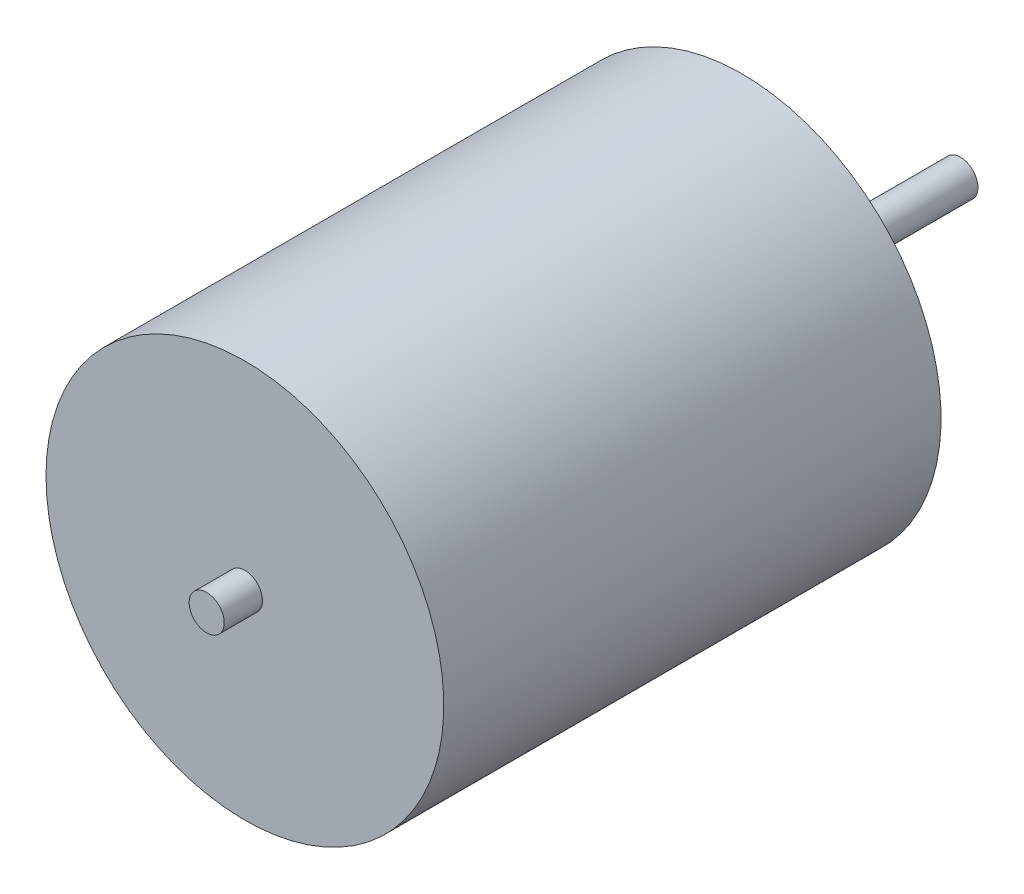
ISO-10303-21;
HEADER;
FILE_DESCRIPTION(('STEP AP214'),'2;1');
FILE_NAME('part.step','',(''),(''),'','','');
FILE_SCHEMA(('AUTOMOTIVE_DESIGN { 1 0 10303 214 1 1 1 1 }'));
ENDSEC;
DATA;
#1=APPLICATION_CONTEXT('core data for automotive mechanical design processes');
#2=APPLICATION_PROTOCOL_DEFINITION('international standard','automotive_design',2000,#1);
#3=PRODUCT_CONTEXT('',#1,'mechanical');
#4=PRODUCT('Part','Part','',(#3));
#5=PRODUCT_RELATED_PRODUCT_CATEGORY('part','',(#4));
#6=PRODUCT_DEFINITION_FORMATION('','',#4);
#7=PRODUCT_DEFINITION_CONTEXT('part definition',#1,'design');
#8=PRODUCT_DEFINITION('design','',#6,#7);
#9=PRODUCT_DEFINITION_SHAPE('','',#8);
#10=(LENGTH_UNIT() NAMED_UNIT(*) SI_UNIT(.MILLI.,.METRE.));
#11=(NAMED_UNIT(*) PLANE_ANGLE_UNIT() SI_UNIT($,.RADIAN.));
#12=(NAMED_UNIT(*) SI_UNIT($,.STERADIAN.) SOLID_ANGLE_UNIT());
#13=UNCERTAINTY_MEASURE_WITH_UNIT(LENGTH_MEASURE(1.E-05),#10,'distance_accuracy_value','');
#14=(GEOMETRIC_REPRESENTATION_CONTEXT(3) GLOBAL_UNCERTAINTY_ASSIGNED_CONTEXT((#13)) GLOBAL_UNIT_ASSIGNED_CONTEXT((#10,
#11,#12)) REPRESENTATION_CONTEXT('',''));
#15=CARTESIAN_POINT('',(0.,0.,0.));
#16=DIRECTION('',(0.,0.,1.));
#17=DIRECTION('',(1.,0.,0.));
#18=AXIS2_PLACEMENT_3D('',#15,#16,#17);
#19=CARTESIAN_POINT('',(0.,0.,0.));
#20=DIRECTION('',(0.,0.,-1.));
#21=DIRECTION('',(-1.,0.,0.));
#22=AXIS2_PLACEMENT_3D('',#19,#20,#21);
#23=PLANE('',#22);
#24=CARTESIAN_POINT('',(0.,0.,0.));
#25=DIRECTION('',(0.,0.,-1.));
#26=DIRECTION('',(-1.,0.,0.));
#27=AXIS2_PLACEMENT_3D('',#24,#25,#26);
#28=CIRCLE('',#27,1.5875);
#29=CARTESIAN_POINT('',(-1.5875,0.,0.));
#30=VERTEX_POINT('',#29);
#31=EDGE_CURVE('E171',#30,#30,#28,.T.);
#32=ORIENTED_EDGE('',*,*,#31,.T.);
#33=EDGE_LOOP('',(#32));
#34=FACE_BOUND('',#33,.T.);
#35=CARTESIAN_POINT('',(0.,0.,0.));
#36=DIRECTION('',(0.,0.,-1.));
#37=DIRECTION('',(-1.,0.,0.));
#38=AXIS2_PLACEMENT_3D('',#35,#36,#37);
#39=CIRCLE('',#38,18.);
#40=CARTESIAN_POINT('',(-18.,0.,0.));
#41=VERTEX_POINT('',#40);
#42=EDGE_CURVE('E11',#41,#41,#39,.T.);
#43=ORIENTED_EDGE('',*,*,#42,.F.);
#44=EDGE_LOOP('',(#43));
#45=FACE_BOUND('',#44,.T.);
#46=ADVANCED_FACE('F35',(#34,#45),#23,.F.);
#47=CARTESIAN_POINT('',(0.,0.,-54.9738707388882));
#48=DIRECTION('',(0.,0.,-1.));
#49=DIRECTION('',(-1.,0.,0.));
#50=AXIS2_PLACEMENT_3D('',#47,#48,#49);
#51=CYLINDRICAL_SURFACE('',#50,18.);
#52=CARTESIAN_POINT('',(0.,0.,-45.));
#53=DIRECTION('',(0.,0.,-1.));
#54=DIRECTION('',(-1.,0.,0.));
#55=AXIS2_PLACEMENT_3D('',#52,#53,#54);
#56=CIRCLE('',#55,18.);
#57=CARTESIAN_POINT('',(-18.,0.,-45.));
#58=VERTEX_POINT('',#57);
#59=EDGE_CURVE('E43',#58,#58,#56,.T.);
#60=ORIENTED_EDGE('',*,*,#59,.F.);
#61=EDGE_LOOP('',(#60));
#62=FACE_BOUND('',#61,.T.);
#63=ORIENTED_EDGE('',*,*,#42,.T.);
#64=EDGE_LOOP('',(#63));
#65=FACE_BOUND('',#64,.T.);
#66=ADVANCED_FACE('F191',(#62,#65),#51,.T.);
#67=CARTESIAN_POINT('',(18.,0.,-45.));
#68=DIRECTION('',(0.,0.,1.));
#69=DIRECTION('',(1.,0.,0.));
#70=AXIS2_PLACEMENT_3D('',#67,#68,#69);
#71=PLANE('',#70);
#72=CARTESIAN_POINT('',(9.54594154601818,-9.54594154601861,-45.));
#73=DIRECTION('',(0.,0.,-1.));
#74=DIRECTION('',(1.,0.,0.));
#75=AXIS2_PLACEMENT_3D('',#72,#73,#74);
#76=CIRCLE('',#75,1.5);
#77=CARTESIAN_POINT('',(11.0459415460182,-9.54594154601861,-45.));
#78=VERTEX_POINT('',#77);
#79=EDGE_CURVE('E243',#78,#78,#76,.T.);
#80=ORIENTED_EDGE('',*,*,#79,.F.);
#81=EDGE_LOOP('',(#80));
#82=FACE_BOUND('',#81,.T.);
#83=CARTESIAN_POINT('',(-9.54594154601837,9.54594154601841,-45.));
#84=DIRECTION('',(0.,0.,-1.));
#85=DIRECTION('',(-1.,0.,0.));
#86=AXIS2_PLACEMENT_3D('',#83,#84,#85);
#87=CIRCLE('',#86,1.5);
#88=CARTESIAN_POINT('',(-11.0459415460184,9.54594154601841,-45.));
#89=VERTEX_POINT('',#88);
#90=EDGE_CURVE('E247',#89,#89,#87,.T.);
#91=ORIENTED_EDGE('',*,*,#90,.F.);
#92=EDGE_LOOP('',(#91));
#93=FACE_BOUND('',#92,.T.);
#94=CARTESIAN_POINT('',(0.,0.,-45.));
#95=DIRECTION('',(0.,0.,1.));
#96=DIRECTION('',(1.,0.,0.));
#97=AXIS2_PLACEMENT_3D('',#94,#95,#96);
#98=CIRCLE('',#97,11.);
#99=CARTESIAN_POINT('',(-11.,0.,-45.));
#100=VERTEX_POINT('',#99);
#101=CARTESIAN_POINT('',(0.,-11.,-45.));
#102=VERTEX_POINT('',#101);
#103=EDGE_CURVE('E252',#100,#102,#98,.T.);
#104=ORIENTED_EDGE('',*,*,#103,.F.);
#105=CARTESIAN_POINT('',(-12.5,0.,-45.));
#106=DIRECTION('',(0.,0.,-1.));
#107=DIRECTION('',(1.,0.,0.));
#108=AXIS2_PLACEMENT_3D('',#105,#106,#107);
#109=CIRCLE('',#108,1.5);
#110=CARTESIAN_POINT('',(-14.,0.,-45.));
#111=VERTEX_POINT('',#110);
#112=EDGE_CURVE('E50',#111,#100,#109,.T.);
#113=ORIENTED_EDGE('',*,*,#112,.F.);
#114=CARTESIAN_POINT('',(0.,0.,-45.));
#115=DIRECTION('',(0.,0.,-1.));
#116=DIRECTION('',(1.,0.,0.));
#117=AXIS2_PLACEMENT_3D('',#114,#115,#116);
#118=CIRCLE('',#117,14.);
#119=CARTESIAN_POINT('',(0.,-14.,-45.));
#120=VERTEX_POINT('',#119);
#121=EDGE_CURVE('E106',#120,#111,#118,.T.);
#122=ORIENTED_EDGE('',*,*,#121,.F.);
#123=CARTESIAN_POINT('',(0.,-12.5,-45.));
#124=DIRECTION('',(0.,0.,-1.));
#125=DIRECTION('',(1.,0.,0.));
#126=AXIS2_PLACEMENT_3D('',#123,#124,#125);
#127=CIRCLE('',#126,1.5);
#128=EDGE_CURVE('E446',#102,#120,#127,.T.);
#129=ORIENTED_EDGE('',*,*,#128,.F.);
#130=EDGE_LOOP('',(#104,#113,#122,#129));
#131=FACE_BOUND('',#130,.T.);
#132=CARTESIAN_POINT('',(0.,0.,-45.));
#133=DIRECTION('',(0.,0.,-1.));
#134=DIRECTION('',(-1.,0.,0.));
#135=AXIS2_PLACEMENT_3D('',#132,#133,#134);
#136=CIRCLE('',#135,14.);
#137=CARTESIAN_POINT('',(0.,14.,-45.));
#138=VERTEX_POINT('',#137);
#139=CARTESIAN_POINT('',(14.,0.,-45.));
#140=VERTEX_POINT('',#139);
#141=EDGE_CURVE('E139',#138,#140,#136,.T.);
#142=ORIENTED_EDGE('',*,*,#141,.F.);
#143=CARTESIAN_POINT('',(0.,12.5,-45.));
#144=DIRECTION('',(0.,0.,-1.));
#145=DIRECTION('',(-1.,0.,0.));
#146=AXIS2_PLACEMENT_3D('',#143,#144,#145);
#147=CIRCLE('',#146,1.5);
#148=CARTESIAN_POINT('',(0.,11.,-45.));
#149=VERTEX_POINT('',#148);
#150=EDGE_CURVE('E142',#149,#138,#147,.T.);
#151=ORIENTED_EDGE('',*,*,#150,.F.);
#152=CARTESIAN_POINT('',(0.,0.,-45.));
#153=DIRECTION('',(0.,0.,1.));
#154=DIRECTION('',(-1.,0.,0.));
#155=AXIS2_PLACEMENT_3D('',#152,#153,#154);
#156=CIRCLE('',#155,11.);
#157=CARTESIAN_POINT('',(11.,0.,-45.));
#158=VERTEX_POINT('',#157);
#159=EDGE_CURVE('E132',#158,#149,#156,.T.);
#160=ORIENTED_EDGE('',*,*,#159,.F.);
#161=CARTESIAN_POINT('',(12.5,0.,-45.));
#162=DIRECTION('',(0.,0.,-1.));
#163=DIRECTION('',(-1.,0.,0.));
#164=AXIS2_PLACEMENT_3D('',#161,#162,#163);
#165=CIRCLE('',#164,1.5);
#166=EDGE_CURVE('E136',#140,#158,#165,.T.);
#167=ORIENTED_EDGE('',*,*,#166,.F.);
#168=EDGE_LOOP('',(#142,#151,#160,#167));
#169=FACE_BOUND('',#168,.T.);
#170=CARTESIAN_POINT('',(0.,0.,-45.));
#171=DIRECTION('',(0.,0.,-1.));
#172=DIRECTION('',(-1.,0.,0.));
#173=AXIS2_PLACEMENT_3D('',#170,#171,#172);
#174=CIRCLE('',#173,6.5);
#175=CARTESIAN_POINT('',(-6.5,0.,-45.));
#176=VERTEX_POINT('',#175);
#177=EDGE_CURVE('E183',#176,#176,#174,.T.);
#178=ORIENTED_EDGE('',*,*,#177,.F.);
#179=EDGE_LOOP('',(#178));
#180=FACE_BOUND('',#179,.T.);
#181=ORIENTED_EDGE('',*,*,#59,.T.);
#182=EDGE_LOOP('',(#181));
#183=FACE_BOUND('',#182,.T.);
#184=ADVANCED_FACE('F189',(#82,#93,#131,#169,#180,#183),#71,.F.);
#185=CARTESIAN_POINT('',(0.,0.,-54.9738707388882));
#186=DIRECTION('',(0.,0.,-1.));
#187=DIRECTION('',(-1.,0.,0.));
#188=AXIS2_PLACEMENT_3D('',#185,#186,#187);
#189=CYLINDRICAL_SURFACE('',#188,6.5);
#190=CARTESIAN_POINT('',(0.,0.,-50.));
#191=DIRECTION('',(0.,0.,-1.));
#192=DIRECTION('',(-1.,0.,0.));
#193=AXIS2_PLACEMENT_3D('',#190,#191,#192);
#194=CIRCLE('',#193,6.5);
#195=CARTESIAN_POINT('',(-6.5,0.,-50.));
#196=VERTEX_POINT('',#195);
#197=EDGE_CURVE('E180',#196,#196,#194,.T.);
#198=ORIENTED_EDGE('',*,*,#197,.F.);
#199=EDGE_LOOP('',(#198));
#200=FACE_BOUND('',#199,.T.);
#201=ORIENTED_EDGE('',*,*,#177,.T.);
#202=EDGE_LOOP('',(#201));
#203=FACE_BOUND('',#202,.T.);
#204=ADVANCED_FACE('F231',(#200,#203),#189,.T.);
#205=CARTESIAN_POINT('',(6.5,0.,-50.));
#206=DIRECTION('',(0.,0.,1.));
#207=DIRECTION('',(1.,0.,0.));
#208=AXIS2_PLACEMENT_3D('',#205,#206,#207);
#209=PLANE('',#208);
#210=CARTESIAN_POINT('',(0.,0.,-50.));
#211=DIRECTION('',(0.,0.,-1.));
#212=DIRECTION('',(-1.,0.,0.));
#213=AXIS2_PLACEMENT_3D('',#210,#211,#212);
#214=CIRCLE('',#213,5.45507868216742);
#215=CARTESIAN_POINT('',(-5.45507868216742,0.,-50.));
#216=VERTEX_POINT('',#215);
#217=EDGE_CURVE('E177',#216,#216,#214,.T.);
#218=ORIENTED_EDGE('',*,*,#217,.F.);
#219=EDGE_LOOP('',(#218));
#220=FACE_BOUND('',#219,.T.);
#221=ORIENTED_EDGE('',*,*,#197,.T.);
#222=EDGE_LOOP('',(#221));
#223=FACE_BOUND('',#222,.T.);
#224=ADVANCED_FACE('F227',(#220,#223),#209,.F.);
#225=CARTESIAN_POINT('',(0.,0.,-54.9738707388882));
#226=DIRECTION('',(0.,0.,-1.));
#227=DIRECTION('',(-1.,0.,0.));
#228=AXIS2_PLACEMENT_3D('',#225,#226,#227);
#229=CYLINDRICAL_SURFACE('',#228,5.45507868216742);
#230=CARTESIAN_POINT('',(0.,0.,-49.6));
#231=DIRECTION('',(0.,0.,-1.));
#232=DIRECTION('',(-1.,0.,0.));
#233=AXIS2_PLACEMENT_3D('',#230,#231,#232);
#234=CIRCLE('',#233,5.45507868216742);
#235=CARTESIAN_POINT('',(-5.45507868216742,0.,-49.6));
#236=VERTEX_POINT('',#235);
#237=EDGE_CURVE('E174',#236,#236,#234,.T.);
#238=ORIENTED_EDGE('',*,*,#237,.F.);
#239=EDGE_LOOP('',(#238));
#240=FACE_BOUND('',#239,.T.);
#241=ORIENTED_EDGE('',*,*,#217,.T.);
#242=EDGE_LOOP('',(#241));
#243=FACE_BOUND('',#242,.T.);
#244=ADVANCED_FACE('F223',(#240,#243),#229,.F.);
#245=CARTESIAN_POINT('',(5.45507868216743,0.,-49.6));
#246=DIRECTION('',(0.,0.,1.));
#247=DIRECTION('',(1.,0.,0.));
#248=AXIS2_PLACEMENT_3D('',#245,#246,#247);
#249=PLANE('',#248);
#250=CARTESIAN_POINT('',(0.,0.,-49.6));
#251=DIRECTION('',(0.,0.,1.));
#252=DIRECTION('',(1.,0.,0.));
#253=AXIS2_PLACEMENT_3D('',#250,#251,#252);
#254=CIRCLE('',#253,1.5875);
#255=CARTESIAN_POINT('',(1.5875,0.,-49.6));
#256=VERTEX_POINT('',#255);
#257=EDGE_CURVE('E38',#256,#256,#254,.T.);
#258=ORIENTED_EDGE('',*,*,#257,.T.);
#259=EDGE_LOOP('',(#258));
#260=FACE_BOUND('',#259,.T.);
#261=ORIENTED_EDGE('',*,*,#237,.T.);
#262=EDGE_LOOP('',(#261));
#263=FACE_BOUND('',#262,.T.);
#264=ADVANCED_FACE('F220',(#260,#263),#249,.F.);
#265=CARTESIAN_POINT('',(0.,0.,-64.7594664586109));
#266=DIRECTION('',(0.,0.,1.));
#267=DIRECTION('',(1.,0.,0.));
#268=AXIS2_PLACEMENT_3D('',#265,#266,#267);
#269=PLANE('',#268);
#270=CARTESIAN_POINT('',(0.,0.,-64.7594664586109));
#271=DIRECTION('',(0.,0.,1.));
#272=DIRECTION('',(1.,0.,0.));
#273=AXIS2_PLACEMENT_3D('',#270,#271,#272);
#274=CIRCLE('',#273,1.5875);
#275=CARTESIAN_POINT('',(1.5875,0.,-64.7594664586109));
#276=VERTEX_POINT('',#275);
#277=EDGE_CURVE('E165',#276,#276,#274,.T.);
#278=ORIENTED_EDGE('',*,*,#277,.F.);
#279=EDGE_LOOP('',(#278));
#280=FACE_BOUND('',#279,.T.);
#281=ADVANCED_FACE('F215',(#280),#269,.F.);
#282=CARTESIAN_POINT('',(0.,0.,0.));
#283=DIRECTION('',(0.,0.,1.));
#284=DIRECTION('',(1.,0.,0.));
#285=AXIS2_PLACEMENT_3D('',#282,#283,#284);
#286=CYLINDRICAL_SURFACE('',#285,1.5875);
#287=ORIENTED_EDGE('',*,*,#277,.T.);
#288=EDGE_LOOP('',(#287));
#289=FACE_BOUND('',#288,.T.);
#290=ORIENTED_EDGE('',*,*,#257,.F.);
#291=EDGE_LOOP('',(#290));
#292=FACE_BOUND('',#291,.T.);
#293=ADVANCED_FACE('F205',(#289,#292),#286,.T.);
#294=CARTESIAN_POINT('',(0.,0.,3.45866041972442));
#295=DIRECTION('',(0.,0.,1.));
#296=DIRECTION('',(1.,0.,0.));
#297=AXIS2_PLACEMENT_3D('',#294,#295,#296);
#298=CIRCLE('',#297,1.5875);
#299=CARTESIAN_POINT('',(1.5875,0.,3.45866041972442));
#300=VERTEX_POINT('',#299);
#301=EDGE_CURVE('E168',#300,#300,#298,.T.);
#302=ORIENTED_EDGE('',*,*,#301,.F.);
#303=EDGE_LOOP('',(#302));
#304=FACE_BOUND('',#303,.T.);
#305=ORIENTED_EDGE('',*,*,#31,.F.);
#306=EDGE_LOOP('',(#305));
#307=FACE_BOUND('',#306,.T.);
#308=ADVANCED_FACE('F202',(#304,#307),#286,.T.);
#309=CARTESIAN_POINT('',(1.5875,0.,3.45866041972442));
#310=DIRECTION('',(0.,0.,-1.));
#311=DIRECTION('',(-1.,0.,0.));
#312=AXIS2_PLACEMENT_3D('',#309,#310,#311);
#313=PLANE('',#312);
#314=ORIENTED_EDGE('',*,*,#301,.T.);
#315=EDGE_LOOP('',(#314));
#316=FACE_BOUND('',#315,.T.);
#317=ADVANCED_FACE('F204',(#316),#313,.F.);
#318=CARTESIAN_POINT('',(0.,12.5,3.45966041972443));
#319=DIRECTION('',(0.,0.,-1.));
#320=DIRECTION('',(-1.,0.,0.));
#321=AXIS2_PLACEMENT_3D('',#318,#319,#320);
#322=CYLINDRICAL_SURFACE('',#321,1.5);
#323=CARTESIAN_POINT('',(0.,12.5,-43.5));
#324=DIRECTION('',(0.,0.,-1.));
#325=DIRECTION('',(-1.,0.,0.));
#326=AXIS2_PLACEMENT_3D('',#323,#324,#325);
#327=CIRCLE('',#326,1.5);
#328=CARTESIAN_POINT('',(0.,14.,-43.5));
#329=VERTEX_POINT('',#328);
#330=CARTESIAN_POINT('',(0.,11.,-43.5));
#331=VERTEX_POINT('',#330);
#332=EDGE_CURVE('E131',#329,#331,#327,.F.);
#333=ORIENTED_EDGE('',*,*,#332,.T.);
#334=DIRECTION('',(0.,0.,-1.));
#335=VECTOR('',#334,1.);
#336=CARTESIAN_POINT('',(0.,11.,3.45966041972443));
#337=LINE('',#336,#335);
#338=EDGE_CURVE('E153',#331,#149,#337,.T.);
#339=ORIENTED_EDGE('',*,*,#338,.T.);
#340=ORIENTED_EDGE('',*,*,#150,.T.);
#341=DIRECTION('',(0.,0.,-1.));
#342=VECTOR('',#341,1.);
#343=CARTESIAN_POINT('',(0.,14.,3.45966041972443));
#344=LINE('',#343,#342);
#345=EDGE_CURVE('E152',#329,#138,#344,.T.);
#346=ORIENTED_EDGE('',*,*,#345,.F.);
#347=EDGE_LOOP('',(#333,#339,#340,#346));
#348=FACE_BOUND('',#347,.T.);
#349=ADVANCED_FACE('F212',(#348),#322,.F.);
#350=CARTESIAN_POINT('',(0.,0.,3.45966041972443));
#351=DIRECTION('',(0.,0.,-1.));
#352=DIRECTION('',(-1.,0.,0.));
#353=AXIS2_PLACEMENT_3D('',#350,#351,#352);
#354=CYLINDRICAL_SURFACE('',#353,11.);
#355=CARTESIAN_POINT('',(0.,0.,-43.5));
#356=DIRECTION('',(0.,0.,-1.));
#357=DIRECTION('',(-1.,0.,0.));
#358=AXIS2_PLACEMENT_3D('',#355,#356,#357);
#359=CIRCLE('',#358,11.);
#360=CARTESIAN_POINT('',(11.,0.,-43.5));
#361=VERTEX_POINT('',#360);
#362=EDGE_CURVE('E147',#331,#361,#359,.T.);
#363=ORIENTED_EDGE('',*,*,#362,.T.);
#364=DIRECTION('',(0.,0.,-1.));
#365=VECTOR('',#364,1.);
#366=CARTESIAN_POINT('',(11.,0.,3.45966041972443));
#367=LINE('',#366,#365);
#368=EDGE_CURVE('E155',#361,#158,#367,.T.);
#369=ORIENTED_EDGE('',*,*,#368,.T.);
#370=ORIENTED_EDGE('',*,*,#159,.T.);
#371=ORIENTED_EDGE('',*,*,#338,.F.);
#372=EDGE_LOOP('',(#363,#369,#370,#371));
#373=FACE_BOUND('',#372,.T.);
#374=ADVANCED_FACE('F268',(#373),#354,.T.);
#375=CARTESIAN_POINT('',(12.5,0.,3.45966041972443));
#376=DIRECTION('',(0.,0.,-1.));
#377=DIRECTION('',(-1.,0.,0.));
#378=AXIS2_PLACEMENT_3D('',#375,#376,#377);
#379=CYLINDRICAL_SURFACE('',#378,1.5);
#380=CARTESIAN_POINT('',(12.5,0.,-43.5));
#381=DIRECTION('',(0.,0.,-1.));
#382=DIRECTION('',(-1.,0.,0.));
#383=AXIS2_PLACEMENT_3D('',#380,#381,#382);
#384=CIRCLE('',#383,1.5);
#385=CARTESIAN_POINT('',(14.,0.,-43.5));
#386=VERTEX_POINT('',#385);
#387=EDGE_CURVE('E150',#361,#386,#384,.F.);
#388=ORIENTED_EDGE('',*,*,#387,.T.);
#389=DIRECTION('',(0.,0.,-1.));
#390=VECTOR('',#389,1.);
#391=CARTESIAN_POINT('',(14.,0.,3.45966041972443));
#392=LINE('',#391,#390);
#393=EDGE_CURVE('E144',#386,#140,#392,.T.);
#394=ORIENTED_EDGE('',*,*,#393,.T.);
#395=ORIENTED_EDGE('',*,*,#166,.T.);
#396=ORIENTED_EDGE('',*,*,#368,.F.);
#397=EDGE_LOOP('',(#388,#394,#395,#396));
#398=FACE_BOUND('',#397,.T.);
#399=ADVANCED_FACE('F271',(#398),#379,.F.);
#400=CARTESIAN_POINT('',(0.,0.,3.45966041972443));
#401=DIRECTION('',(0.,0.,-1.));
#402=DIRECTION('',(-1.,0.,0.));
#403=AXIS2_PLACEMENT_3D('',#400,#401,#402);
#404=CYLINDRICAL_SURFACE('',#403,14.);
#405=CARTESIAN_POINT('',(0.,0.,-43.5));
#406=DIRECTION('',(0.,0.,-1.));
#407=DIRECTION('',(-1.,0.,0.));
#408=AXIS2_PLACEMENT_3D('',#405,#406,#407);
#409=CIRCLE('',#408,14.);
#410=EDGE_CURVE('E128',#386,#329,#409,.F.);
#411=ORIENTED_EDGE('',*,*,#410,.T.);
#412=ORIENTED_EDGE('',*,*,#345,.T.);
#413=ORIENTED_EDGE('',*,*,#141,.T.);
#414=ORIENTED_EDGE('',*,*,#393,.F.);
#415=EDGE_LOOP('',(#411,#412,#413,#414));
#416=FACE_BOUND('',#415,.T.);
#417=ADVANCED_FACE('F262',(#416),#404,.F.);
#418=CARTESIAN_POINT('',(16.5,0.,-43.5));
#419=DIRECTION('',(0.,0.,-1.));
#420=DIRECTION('',(-1.,0.,0.));
#421=AXIS2_PLACEMENT_3D('',#418,#419,#420);
#422=PLANE('',#421);
#423=CARTESIAN_POINT('',(9.54594154601818,-9.54594154601861,-43.5));
#424=DIRECTION('',(0.,0.,-1.));
#425=DIRECTION('',(-1.,0.,0.));
#426=AXIS2_PLACEMENT_3D('',#423,#424,#425);
#427=CIRCLE('',#426,1.5);
#428=CARTESIAN_POINT('',(8.04594154601818,-9.54594154601861,-43.5));
#429=VERTEX_POINT('',#428);
#430=EDGE_CURVE('E436',#429,#429,#427,.F.);
#431=ORIENTED_EDGE('',*,*,#430,.F.);
#432=EDGE_LOOP('',(#431));
#433=FACE_BOUND('',#432,.T.);
#434=CARTESIAN_POINT('',(-9.54594154601837,9.54594154601841,-43.5));
#435=DIRECTION('',(0.,0.,-1.));
#436=DIRECTION('',(-1.,0.,0.));
#437=AXIS2_PLACEMENT_3D('',#434,#435,#436);
#438=CIRCLE('',#437,1.5);
#439=CARTESIAN_POINT('',(-11.0459415460184,9.54594154601841,-43.5));
#440=VERTEX_POINT('',#439);
#441=EDGE_CURVE('E438',#440,#440,#438,.F.);
#442=ORIENTED_EDGE('',*,*,#441,.F.);
#443=EDGE_LOOP('',(#442));
#444=FACE_BOUND('',#443,.T.);
#445=CARTESIAN_POINT('',(0.,0.,-43.5));
#446=DIRECTION('',(0.,0.,-1.));
#447=DIRECTION('',(-1.,0.,0.));
#448=AXIS2_PLACEMENT_3D('',#445,#446,#447);
#449=CIRCLE('',#448,14.);
#450=CARTESIAN_POINT('',(-14.,0.,-43.5));
#451=VERTEX_POINT('',#450);
#452=CARTESIAN_POINT('',(0.,-14.,-43.5));
#453=VERTEX_POINT('',#452);
#454=EDGE_CURVE('E104',#451,#453,#449,.F.);
#455=ORIENTED_EDGE('',*,*,#454,.F.);
#456=CARTESIAN_POINT('',(-12.5,0.,-43.5));
#457=DIRECTION('',(0.,0.,-1.));
#458=DIRECTION('',(-1.,0.,0.));
#459=AXIS2_PLACEMENT_3D('',#456,#457,#458);
#460=CIRCLE('',#459,1.5);
#461=CARTESIAN_POINT('',(-11.,0.,-43.5));
#462=VERTEX_POINT('',#461);
#463=EDGE_CURVE('E111',#462,#451,#460,.F.);
#464=ORIENTED_EDGE('',*,*,#463,.F.);
#465=CARTESIAN_POINT('',(0.,0.,-43.5));
#466=DIRECTION('',(0.,0.,-1.));
#467=DIRECTION('',(-1.,0.,0.));
#468=AXIS2_PLACEMENT_3D('',#465,#466,#467);
#469=CIRCLE('',#468,11.);
#470=CARTESIAN_POINT('',(0.,-11.,-43.5));
#471=VERTEX_POINT('',#470);
#472=EDGE_CURVE('E116',#471,#462,#469,.T.);
#473=ORIENTED_EDGE('',*,*,#472,.F.);
#474=CARTESIAN_POINT('',(0.,-12.5,-43.5));
#475=DIRECTION('',(0.,0.,-1.));
#476=DIRECTION('',(-1.,0.,0.));
#477=AXIS2_PLACEMENT_3D('',#474,#475,#476);
#478=CIRCLE('',#477,1.5);
#479=EDGE_CURVE('E58',#453,#471,#478,.F.);
#480=ORIENTED_EDGE('',*,*,#479,.F.);
#481=EDGE_LOOP('',(#455,#464,#473,#480));
#482=FACE_BOUND('',#481,.T.);
#483=ORIENTED_EDGE('',*,*,#362,.F.);
#484=ORIENTED_EDGE('',*,*,#332,.F.);
#485=ORIENTED_EDGE('',*,*,#410,.F.);
#486=ORIENTED_EDGE('',*,*,#387,.F.);
#487=EDGE_LOOP('',(#483,#484,#485,#486));
#488=FACE_BOUND('',#487,.T.);
#489=CARTESIAN_POINT('',(0.,0.,-43.5));
#490=DIRECTION('',(0.,0.,1.));
#491=DIRECTION('',(1.,0.,0.));
#492=AXIS2_PLACEMENT_3D('',#489,#490,#491);
#493=CIRCLE('',#492,16.5);
#494=CARTESIAN_POINT('',(16.5,0.,-43.5));
#495=VERTEX_POINT('',#494);
#496=EDGE_CURVE('E135',#495,#495,#493,.T.);
#497=ORIENTED_EDGE('',*,*,#496,.T.);
#498=EDGE_LOOP('',(#497));
#499=FACE_BOUND('',#498,.T.);
#500=ADVANCED_FACE('F118',(#433,#444,#482,#488,#499),#422,.F.);
#501=CARTESIAN_POINT('',(0.,0.,-1.5));
#502=DIRECTION('',(0.,0.,1.));
#503=DIRECTION('',(1.,0.,0.));
#504=AXIS2_PLACEMENT_3D('',#501,#502,#503);
#505=PLANE('',#504);
#506=CARTESIAN_POINT('',(0.,0.,-1.5));
#507=DIRECTION('',(0.,0.,1.));
#508=DIRECTION('',(1.,0.,0.));
#509=AXIS2_PLACEMENT_3D('',#506,#507,#508);
#510=CIRCLE('',#509,16.5);
#511=CARTESIAN_POINT('',(16.5,0.,-1.5));
#512=VERTEX_POINT('',#511);
#513=EDGE_CURVE('E162',#512,#512,#510,.T.);
#514=ORIENTED_EDGE('',*,*,#513,.F.);
#515=EDGE_LOOP('',(#514));
#516=FACE_BOUND('',#515,.T.);
#517=ADVANCED_FACE('F274',(#516),#505,.F.);
#518=CARTESIAN_POINT('',(0.,0.,0.));
#519=DIRECTION('',(0.,0.,1.));
#520=DIRECTION('',(1.,0.,0.));
#521=AXIS2_PLACEMENT_3D('',#518,#519,#520);
#522=CYLINDRICAL_SURFACE('',#521,16.5);
#523=ORIENTED_EDGE('',*,*,#496,.F.);
#524=EDGE_LOOP('',(#523));
#525=FACE_BOUND('',#524,.T.);
#526=ORIENTED_EDGE('',*,*,#513,.T.);
#527=EDGE_LOOP('',(#526));
#528=FACE_BOUND('',#527,.T.);
#529=ADVANCED_FACE('F279',(#525,#528),#522,.F.);
#530=CARTESIAN_POINT('',(-12.5,0.,3.45966041972443));
#531=DIRECTION('',(0.,0.,-1.));
#532=DIRECTION('',(-1.,0.,0.));
#533=AXIS2_PLACEMENT_3D('',#530,#531,#532);
#534=CYLINDRICAL_SURFACE('',#533,1.5);
#535=ORIENTED_EDGE('',*,*,#463,.T.);
#536=DIRECTION('',(0.,0.,-1.));
#537=VECTOR('',#536,1.);
#538=CARTESIAN_POINT('',(-14.,0.,3.45966041972443));
#539=LINE('',#538,#537);
#540=EDGE_CURVE('E100',#451,#111,#539,.T.);
#541=ORIENTED_EDGE('',*,*,#540,.T.);
#542=ORIENTED_EDGE('',*,*,#112,.T.);
#543=DIRECTION('',(0.,0.,-1.));
#544=VECTOR('',#543,1.);
#545=CARTESIAN_POINT('',(-11.,0.,3.45966041972443));
#546=LINE('',#545,#544);
#547=EDGE_CURVE('E108',#462,#100,#546,.T.);
#548=ORIENTED_EDGE('',*,*,#547,.F.);
#549=EDGE_LOOP('',(#535,#541,#542,#548));
#550=FACE_BOUND('',#549,.T.);
#551=ADVANCED_FACE('F112',(#550),#534,.F.);
#552=CARTESIAN_POINT('',(0.,0.,3.45966041972443));
#553=DIRECTION('',(0.,0.,-1.));
#554=DIRECTION('',(-1.,0.,0.));
#555=AXIS2_PLACEMENT_3D('',#552,#553,#554);
#556=CYLINDRICAL_SURFACE('',#555,14.);
#557=ORIENTED_EDGE('',*,*,#454,.T.);
#558=DIRECTION('',(0.,0.,-1.));
#559=VECTOR('',#558,1.);
#560=CARTESIAN_POINT('',(0.,-14.,3.45966041972443));
#561=LINE('',#560,#559);
#562=EDGE_CURVE('E107',#453,#120,#561,.T.);
#563=ORIENTED_EDGE('',*,*,#562,.T.);
#564=ORIENTED_EDGE('',*,*,#121,.T.);
#565=ORIENTED_EDGE('',*,*,#540,.F.);
#566=EDGE_LOOP('',(#557,#563,#564,#565));
#567=FACE_BOUND('',#566,.T.);
#568=ADVANCED_FACE('F102',(#567),#556,.F.);
#569=CARTESIAN_POINT('',(0.,-12.5,3.45966041972443));
#570=DIRECTION('',(0.,0.,-1.));
#571=DIRECTION('',(-1.,0.,0.));
#572=AXIS2_PLACEMENT_3D('',#569,#570,#571);
#573=CYLINDRICAL_SURFACE('',#572,1.5);
#574=ORIENTED_EDGE('',*,*,#479,.T.);
#575=DIRECTION('',(0.,0.,-1.));
#576=VECTOR('',#575,1.);
#577=CARTESIAN_POINT('',(0.,-11.,3.45966041972443));
#578=LINE('',#577,#576);
#579=EDGE_CURVE('E125',#471,#102,#578,.T.);
#580=ORIENTED_EDGE('',*,*,#579,.T.);
#581=ORIENTED_EDGE('',*,*,#128,.T.);
#582=ORIENTED_EDGE('',*,*,#562,.F.);
#583=EDGE_LOOP('',(#574,#580,#581,#582));
#584=FACE_BOUND('',#583,.T.);
#585=ADVANCED_FACE('F391',(#584),#573,.F.);
#586=CARTESIAN_POINT('',(0.,0.,3.45966041972443));
#587=DIRECTION('',(0.,0.,-1.));
#588=DIRECTION('',(-1.,0.,0.));
#589=AXIS2_PLACEMENT_3D('',#586,#587,#588);
#590=CYLINDRICAL_SURFACE('',#589,11.);
#591=ORIENTED_EDGE('',*,*,#472,.T.);
#592=ORIENTED_EDGE('',*,*,#547,.T.);
#593=ORIENTED_EDGE('',*,*,#103,.T.);
#594=ORIENTED_EDGE('',*,*,#579,.F.);
#595=EDGE_LOOP('',(#591,#592,#593,#594));
#596=FACE_BOUND('',#595,.T.);
#597=ADVANCED_FACE('F400',(#596),#590,.T.);
#598=CARTESIAN_POINT('',(-9.54594154601837,9.54594154601841,3.45966041972443));
#599=DIRECTION('',(0.,0.,-1.));
#600=DIRECTION('',(-1.,0.,0.));
#601=AXIS2_PLACEMENT_3D('',#598,#599,#600);
#602=CYLINDRICAL_SURFACE('',#601,1.5);
#603=ORIENTED_EDGE('',*,*,#90,.T.);
#604=EDGE_LOOP('',(#603));
#605=FACE_BOUND('',#604,.T.);
#606=ORIENTED_EDGE('',*,*,#441,.T.);
#607=EDGE_LOOP('',(#606));
#608=FACE_BOUND('',#607,.T.);
#609=ADVANCED_FACE('F409',(#605,#608),#602,.F.);
#610=CARTESIAN_POINT('',(9.54594154601818,-9.54594154601861,3.45966041972443));
#611=DIRECTION('',(0.,0.,-1.));
#612=DIRECTION('',(-1.,0.,0.));
#613=AXIS2_PLACEMENT_3D('',#610,#611,#612);
#614=CYLINDRICAL_SURFACE('',#613,1.5);
#615=ORIENTED_EDGE('',*,*,#79,.T.);
#616=EDGE_LOOP('',(#615));
#617=FACE_BOUND('',#616,.T.);
#618=ORIENTED_EDGE('',*,*,#430,.T.);
#619=EDGE_LOOP('',(#618));
#620=FACE_BOUND('',#619,.T.);
#621=ADVANCED_FACE('F419',(#617,#620),#614,.F.);
#622=CLOSED_SHELL('',(#46,#66,#184,#204,#224,#244,#264,#281,#293,#308,#317,#349,#374,#399,#417,
#500,#517,#529,#551,#568,#585,#597,#609,#621));
#623=MANIFOLD_SOLID_BREP('B2',#622);
#624=ADVANCED_BREP_SHAPE_REPRESENTATION('',(#18,#623),#14);
#625=SHAPE_DEFINITION_REPRESENTATION(#9,#624);
ENDSEC;
END-ISO-10303-21;
